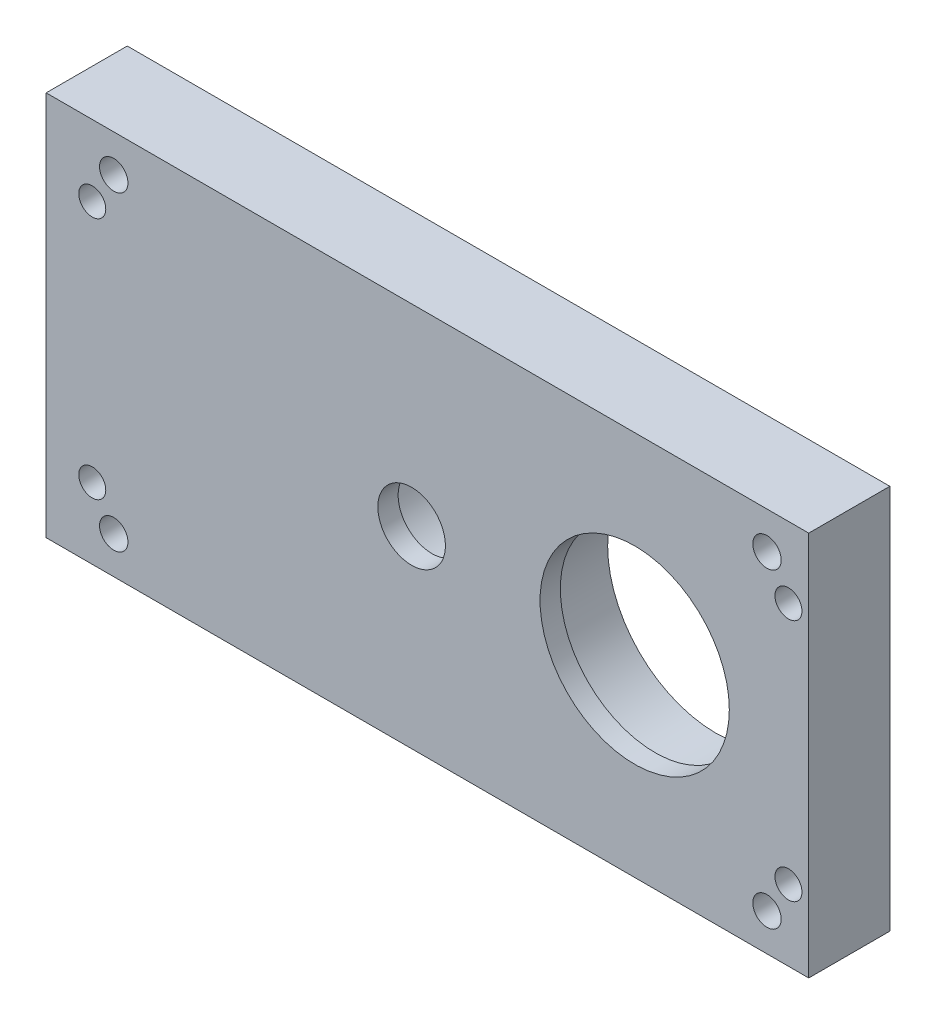
ISO-10303-21;
HEADER;
FILE_DESCRIPTION(('STEP AP214'),'2;1');
FILE_NAME('part.step','',(''),(''),'','','');
FILE_SCHEMA(('AUTOMOTIVE_DESIGN { 1 0 10303 214 1 1 1 1 }'));
ENDSEC;
DATA;
#1=APPLICATION_CONTEXT('core data for automotive mechanical design processes');
#2=APPLICATION_PROTOCOL_DEFINITION('international standard','automotive_design',2000,#1);
#3=PRODUCT_CONTEXT('',#1,'mechanical');
#4=PRODUCT('Part','Part','',(#3));
#5=PRODUCT_RELATED_PRODUCT_CATEGORY('part','',(#4));
#6=PRODUCT_DEFINITION_FORMATION('','',#4);
#7=PRODUCT_DEFINITION_CONTEXT('part definition',#1,'design');
#8=PRODUCT_DEFINITION('design','',#6,#7);
#9=PRODUCT_DEFINITION_SHAPE('','',#8);
#10=(LENGTH_UNIT() NAMED_UNIT(*) SI_UNIT(.MILLI.,.METRE.));
#11=(NAMED_UNIT(*) PLANE_ANGLE_UNIT() SI_UNIT($,.RADIAN.));
#12=(NAMED_UNIT(*) SI_UNIT($,.STERADIAN.) SOLID_ANGLE_UNIT());
#13=UNCERTAINTY_MEASURE_WITH_UNIT(LENGTH_MEASURE(1.E-05),#10,'distance_accuracy_value','');
#14=(GEOMETRIC_REPRESENTATION_CONTEXT(3) GLOBAL_UNCERTAINTY_ASSIGNED_CONTEXT((#13)) GLOBAL_UNIT_ASSIGNED_CONTEXT((#10,
#11,#12)) REPRESENTATION_CONTEXT('',''));
#15=CARTESIAN_POINT('',(0.,0.,0.));
#16=DIRECTION('',(0.,0.,1.));
#17=DIRECTION('',(1.,0.,0.));
#18=AXIS2_PLACEMENT_3D('',#15,#16,#17);
#19=CARTESIAN_POINT('',(28.75,0.,12.));
#20=DIRECTION('',(0.,0.,-1.));
#21=DIRECTION('',(-1.,0.,0.));
#22=AXIS2_PLACEMENT_3D('',#19,#20,#21);
#23=CYLINDRICAL_SURFACE('',#22,16.);
#24=CARTESIAN_POINT('',(28.75,0.,0.));
#25=DIRECTION('',(0.,0.,1.));
#26=DIRECTION('',(1.,0.,0.));
#27=AXIS2_PLACEMENT_3D('',#24,#25,#26);
#28=CIRCLE('',#27,16.);
#29=CARTESIAN_POINT('',(44.75,0.,0.));
#30=VERTEX_POINT('',#29);
#31=EDGE_CURVE('E49',#30,#30,#28,.T.);
#32=ORIENTED_EDGE('',*,*,#31,.F.);
#33=EDGE_LOOP('',(#32));
#34=FACE_BOUND('',#33,.T.);
#35=CARTESIAN_POINT('',(28.75,0.,9.));
#36=DIRECTION('',(0.,0.,1.));
#37=DIRECTION('',(1.,0.,0.));
#38=AXIS2_PLACEMENT_3D('',#35,#36,#37);
#39=CIRCLE('',#38,16.);
#40=CARTESIAN_POINT('',(44.75,0.,9.));
#41=VERTEX_POINT('',#40);
#42=EDGE_CURVE('E114',#41,#41,#39,.T.);
#43=ORIENTED_EDGE('',*,*,#42,.T.);
#44=EDGE_LOOP('',(#43));
#45=FACE_BOUND('',#44,.T.);
#46=ADVANCED_FACE('F39',(#34,#45),#23,.F.);
#47=CARTESIAN_POINT('',(0.,0.,12.));
#48=DIRECTION('',(0.,0.,1.));
#49=DIRECTION('',(1.,0.,0.));
#50=AXIS2_PLACEMENT_3D('',#47,#48,#49);
#51=PLANE('',#50);
#52=CARTESIAN_POINT('',(-4.25,0.,12.));
#53=DIRECTION('',(0.,0.,1.));
#54=DIRECTION('',(1.,0.,0.));
#55=AXIS2_PLACEMENT_3D('',#52,#53,#54);
#56=CIRCLE('',#55,5.);
#57=CARTESIAN_POINT('',(0.75,0.,12.));
#58=VERTEX_POINT('',#57);
#59=EDGE_CURVE('E43',#58,#58,#56,.T.);
#60=ORIENTED_EDGE('',*,*,#59,.F.);
#61=EDGE_LOOP('',(#60));
#62=FACE_BOUND('',#61,.T.);
#63=CARTESIAN_POINT('',(-51.5,18.,12.));
#64=DIRECTION('',(0.,0.,1.));
#65=DIRECTION('',(1.,0.,0.));
#66=AXIS2_PLACEMENT_3D('',#63,#64,#65);
#67=CIRCLE('',#66,2.);
#68=CARTESIAN_POINT('',(-49.5,18.,12.));
#69=VERTEX_POINT('',#68);
#70=EDGE_CURVE('E163',#69,#69,#67,.T.);
#71=ORIENTED_EDGE('',*,*,#70,.F.);
#72=EDGE_LOOP('',(#71));
#73=FACE_BOUND('',#72,.T.);
#74=CARTESIAN_POINT('',(51.5,18.,12.));
#75=DIRECTION('',(0.,0.,1.));
#76=DIRECTION('',(1.,0.,0.));
#77=AXIS2_PLACEMENT_3D('',#74,#75,#76);
#78=CIRCLE('',#77,2.);
#79=CARTESIAN_POINT('',(53.5,18.,12.));
#80=VERTEX_POINT('',#79);
#81=EDGE_CURVE('E179',#80,#80,#78,.T.);
#82=ORIENTED_EDGE('',*,*,#81,.F.);
#83=EDGE_LOOP('',(#82));
#84=FACE_BOUND('',#83,.T.);
#85=CARTESIAN_POINT('',(51.5,-18.,12.));
#86=DIRECTION('',(0.,0.,1.));
#87=DIRECTION('',(1.,0.,0.));
#88=AXIS2_PLACEMENT_3D('',#85,#86,#87);
#89=CIRCLE('',#88,2.);
#90=CARTESIAN_POINT('',(53.5,-18.,12.));
#91=VERTEX_POINT('',#90);
#92=EDGE_CURVE('E187',#91,#91,#89,.T.);
#93=ORIENTED_EDGE('',*,*,#92,.F.);
#94=EDGE_LOOP('',(#93));
#95=FACE_BOUND('',#94,.T.);
#96=CARTESIAN_POINT('',(-51.5,-18.,12.));
#97=DIRECTION('',(0.,0.,1.));
#98=DIRECTION('',(1.,0.,0.));
#99=AXIS2_PLACEMENT_3D('',#96,#97,#98);
#100=CIRCLE('',#99,2.);
#101=CARTESIAN_POINT('',(-49.5,-18.,12.));
#102=VERTEX_POINT('',#101);
#103=EDGE_CURVE('E171',#102,#102,#100,.T.);
#104=ORIENTED_EDGE('',*,*,#103,.F.);
#105=EDGE_LOOP('',(#104));
#106=FACE_BOUND('',#105,.T.);
#107=CARTESIAN_POINT('',(48.32,23.,12.));
#108=DIRECTION('',(0.,0.,1.));
#109=DIRECTION('',(1.,0.,0.));
#110=AXIS2_PLACEMENT_3D('',#107,#108,#109);
#111=CIRCLE('',#110,2.09999999999999);
#112=CARTESIAN_POINT('',(50.42,23.,12.));
#113=VERTEX_POINT('',#112);
#114=EDGE_CURVE('E154',#113,#113,#111,.T.);
#115=ORIENTED_EDGE('',*,*,#114,.F.);
#116=EDGE_LOOP('',(#115));
#117=FACE_BOUND('',#116,.T.);
#118=CARTESIAN_POINT('',(48.32,-23.,12.));
#119=DIRECTION('',(0.,0.,1.));
#120=DIRECTION('',(1.,0.,0.));
#121=AXIS2_PLACEMENT_3D('',#118,#119,#120);
#122=CIRCLE('',#121,2.09999999999998);
#123=CARTESIAN_POINT('',(50.42,-23.,12.));
#124=VERTEX_POINT('',#123);
#125=EDGE_CURVE('E146',#124,#124,#122,.T.);
#126=ORIENTED_EDGE('',*,*,#125,.F.);
#127=EDGE_LOOP('',(#126));
#128=FACE_BOUND('',#127,.T.);
#129=CARTESIAN_POINT('',(-48.32,-23.,12.));
#130=DIRECTION('',(0.,0.,1.));
#131=DIRECTION('',(1.,0.,0.));
#132=AXIS2_PLACEMENT_3D('',#129,#130,#131);
#133=CIRCLE('',#132,2.09999999999998);
#134=CARTESIAN_POINT('',(-46.22,-23.,12.));
#135=VERTEX_POINT('',#134);
#136=EDGE_CURVE('E138',#135,#135,#133,.T.);
#137=ORIENTED_EDGE('',*,*,#136,.F.);
#138=EDGE_LOOP('',(#137));
#139=FACE_BOUND('',#138,.T.);
#140=CARTESIAN_POINT('',(-48.32,23.,12.));
#141=DIRECTION('',(0.,0.,1.));
#142=DIRECTION('',(1.,0.,0.));
#143=AXIS2_PLACEMENT_3D('',#140,#141,#142);
#144=CIRCLE('',#143,2.09999999999999);
#145=CARTESIAN_POINT('',(-46.22,23.,12.));
#146=VERTEX_POINT('',#145);
#147=EDGE_CURVE('E130',#146,#146,#144,.T.);
#148=ORIENTED_EDGE('',*,*,#147,.F.);
#149=EDGE_LOOP('',(#148));
#150=FACE_BOUND('',#149,.T.);
#151=DIRECTION('',(0.,1.,0.));
#152=VECTOR('',#151,1.);
#153=CARTESIAN_POINT('',(54.5,-28.5,12.));
#154=LINE('',#153,#152);
#155=CARTESIAN_POINT('',(54.5,-28.5,12.));
#156=VERTEX_POINT('',#155);
#157=CARTESIAN_POINT('',(54.5,28.5,12.));
#158=VERTEX_POINT('',#157);
#159=EDGE_CURVE('E88',#156,#158,#154,.T.);
#160=ORIENTED_EDGE('',*,*,#159,.T.);
#161=DIRECTION('',(-1.,0.,0.));
#162=VECTOR('',#161,1.);
#163=CARTESIAN_POINT('',(-58.32,28.5,12.));
#164=LINE('',#163,#162);
#165=CARTESIAN_POINT('',(-58.32,28.5,12.));
#166=VERTEX_POINT('',#165);
#167=EDGE_CURVE('E109',#158,#166,#164,.T.);
#168=ORIENTED_EDGE('',*,*,#167,.T.);
#169=DIRECTION('',(0.,-1.,0.));
#170=VECTOR('',#169,1.);
#171=CARTESIAN_POINT('',(-58.32,28.5,12.));
#172=LINE('',#171,#170);
#173=CARTESIAN_POINT('',(-58.32,-28.5,12.));
#174=VERTEX_POINT('',#173);
#175=EDGE_CURVE('E113',#166,#174,#172,.T.);
#176=ORIENTED_EDGE('',*,*,#175,.T.);
#177=DIRECTION('',(1.,0.,0.));
#178=VECTOR('',#177,1.);
#179=CARTESIAN_POINT('',(-58.32,-28.5,12.));
#180=LINE('',#179,#178);
#181=EDGE_CURVE('E56',#174,#156,#180,.T.);
#182=ORIENTED_EDGE('',*,*,#181,.T.);
#183=EDGE_LOOP('',(#160,#168,#176,#182));
#184=FACE_BOUND('',#183,.T.);
#185=CARTESIAN_POINT('',(28.75,0.,12.));
#186=DIRECTION('',(0.,0.,1.));
#187=DIRECTION('',(1.,0.,0.));
#188=AXIS2_PLACEMENT_3D('',#185,#186,#187);
#189=CIRCLE('',#188,14.);
#190=CARTESIAN_POINT('',(42.75,0.,12.));
#191=VERTEX_POINT('',#190);
#192=EDGE_CURVE('E212',#191,#191,#189,.T.);
#193=ORIENTED_EDGE('',*,*,#192,.F.);
#194=EDGE_LOOP('',(#193));
#195=FACE_BOUND('',#194,.T.);
#196=ADVANCED_FACE('F202',(#62,#73,#84,#95,#106,#117,#128,#139,#150,#184,#195),#51,.T.);
#197=CARTESIAN_POINT('',(0.,0.,0.));
#198=DIRECTION('',(0.,0.,1.));
#199=DIRECTION('',(1.,0.,0.));
#200=AXIS2_PLACEMENT_3D('',#197,#198,#199);
#201=PLANE('',#200);
#202=CARTESIAN_POINT('',(-51.5,18.,0.));
#203=DIRECTION('',(0.,0.,1.));
#204=DIRECTION('',(1.,0.,0.));
#205=AXIS2_PLACEMENT_3D('',#202,#203,#204);
#206=CIRCLE('',#205,2.);
#207=CARTESIAN_POINT('',(-49.5,18.,0.));
#208=VERTEX_POINT('',#207);
#209=EDGE_CURVE('E162',#208,#208,#206,.T.);
#210=ORIENTED_EDGE('',*,*,#209,.T.);
#211=EDGE_LOOP('',(#210));
#212=FACE_BOUND('',#211,.T.);
#213=CARTESIAN_POINT('',(-51.5,-18.,0.));
#214=DIRECTION('',(0.,0.,1.));
#215=DIRECTION('',(1.,0.,0.));
#216=AXIS2_PLACEMENT_3D('',#213,#214,#215);
#217=CIRCLE('',#216,2.);
#218=CARTESIAN_POINT('',(-49.5,-18.,0.));
#219=VERTEX_POINT('',#218);
#220=EDGE_CURVE('E167',#219,#219,#217,.T.);
#221=ORIENTED_EDGE('',*,*,#220,.T.);
#222=EDGE_LOOP('',(#221));
#223=FACE_BOUND('',#222,.T.);
#224=CARTESIAN_POINT('',(51.5,18.,0.));
#225=DIRECTION('',(0.,0.,1.));
#226=DIRECTION('',(1.,0.,0.));
#227=AXIS2_PLACEMENT_3D('',#224,#225,#226);
#228=CIRCLE('',#227,2.);
#229=CARTESIAN_POINT('',(53.5,18.,0.));
#230=VERTEX_POINT('',#229);
#231=EDGE_CURVE('E175',#230,#230,#228,.T.);
#232=ORIENTED_EDGE('',*,*,#231,.T.);
#233=EDGE_LOOP('',(#232));
#234=FACE_BOUND('',#233,.T.);
#235=CARTESIAN_POINT('',(51.5,-18.,0.));
#236=DIRECTION('',(0.,0.,1.));
#237=DIRECTION('',(1.,0.,0.));
#238=AXIS2_PLACEMENT_3D('',#235,#236,#237);
#239=CIRCLE('',#238,2.);
#240=CARTESIAN_POINT('',(53.5,-18.,0.));
#241=VERTEX_POINT('',#240);
#242=EDGE_CURVE('E183',#241,#241,#239,.T.);
#243=ORIENTED_EDGE('',*,*,#242,.T.);
#244=EDGE_LOOP('',(#243));
#245=FACE_BOUND('',#244,.T.);
#246=ORIENTED_EDGE('',*,*,#31,.T.);
#247=EDGE_LOOP('',(#246));
#248=FACE_BOUND('',#247,.T.);
#249=CARTESIAN_POINT('',(-4.25,0.,0.));
#250=DIRECTION('',(0.,0.,1.));
#251=DIRECTION('',(1.,0.,0.));
#252=AXIS2_PLACEMENT_3D('',#249,#250,#251);
#253=CIRCLE('',#252,9.5);
#254=CARTESIAN_POINT('',(5.25,0.,0.));
#255=VERTEX_POINT('',#254);
#256=EDGE_CURVE('E11',#255,#255,#253,.T.);
#257=ORIENTED_EDGE('',*,*,#256,.T.);
#258=EDGE_LOOP('',(#257));
#259=FACE_BOUND('',#258,.T.);
#260=CARTESIAN_POINT('',(48.32,23.,0.));
#261=DIRECTION('',(0.,0.,1.));
#262=DIRECTION('',(1.,0.,0.));
#263=AXIS2_PLACEMENT_3D('',#260,#261,#262);
#264=CIRCLE('',#263,2.1);
#265=CARTESIAN_POINT('',(50.42,23.,0.));
#266=VERTEX_POINT('',#265);
#267=EDGE_CURVE('E158',#266,#266,#264,.T.);
#268=ORIENTED_EDGE('',*,*,#267,.T.);
#269=EDGE_LOOP('',(#268));
#270=FACE_BOUND('',#269,.T.);
#271=CARTESIAN_POINT('',(48.32,-23.,0.));
#272=DIRECTION('',(0.,0.,1.));
#273=DIRECTION('',(1.,0.,0.));
#274=AXIS2_PLACEMENT_3D('',#271,#272,#273);
#275=CIRCLE('',#274,2.1);
#276=CARTESIAN_POINT('',(50.42,-23.,0.));
#277=VERTEX_POINT('',#276);
#278=EDGE_CURVE('E150',#277,#277,#275,.T.);
#279=ORIENTED_EDGE('',*,*,#278,.T.);
#280=EDGE_LOOP('',(#279));
#281=FACE_BOUND('',#280,.T.);
#282=CARTESIAN_POINT('',(-48.32,-23.,0.));
#283=DIRECTION('',(0.,0.,1.));
#284=DIRECTION('',(1.,0.,0.));
#285=AXIS2_PLACEMENT_3D('',#282,#283,#284);
#286=CIRCLE('',#285,2.1);
#287=CARTESIAN_POINT('',(-46.22,-23.,0.));
#288=VERTEX_POINT('',#287);
#289=EDGE_CURVE('E142',#288,#288,#286,.T.);
#290=ORIENTED_EDGE('',*,*,#289,.T.);
#291=EDGE_LOOP('',(#290));
#292=FACE_BOUND('',#291,.T.);
#293=CARTESIAN_POINT('',(-48.32,23.,0.));
#294=DIRECTION('',(0.,0.,1.));
#295=DIRECTION('',(1.,0.,0.));
#296=AXIS2_PLACEMENT_3D('',#293,#294,#295);
#297=CIRCLE('',#296,2.1);
#298=CARTESIAN_POINT('',(-46.22,23.,0.));
#299=VERTEX_POINT('',#298);
#300=EDGE_CURVE('E134',#299,#299,#297,.T.);
#301=ORIENTED_EDGE('',*,*,#300,.T.);
#302=EDGE_LOOP('',(#301));
#303=FACE_BOUND('',#302,.T.);
#304=DIRECTION('',(-1.,0.,0.));
#305=VECTOR('',#304,1.);
#306=CARTESIAN_POINT('',(-58.32,28.5,0.));
#307=LINE('',#306,#305);
#308=CARTESIAN_POINT('',(54.5,28.5,0.));
#309=VERTEX_POINT('',#308);
#310=CARTESIAN_POINT('',(-58.32,28.5,0.));
#311=VERTEX_POINT('',#310);
#312=EDGE_CURVE('E64',#309,#311,#307,.T.);
#313=ORIENTED_EDGE('',*,*,#312,.F.);
#314=DIRECTION('',(0.,1.,0.));
#315=VECTOR('',#314,1.);
#316=CARTESIAN_POINT('',(54.5,-28.5,0.));
#317=LINE('',#316,#315);
#318=CARTESIAN_POINT('',(54.5,-28.5,0.));
#319=VERTEX_POINT('',#318);
#320=EDGE_CURVE('E86',#319,#309,#317,.T.);
#321=ORIENTED_EDGE('',*,*,#320,.F.);
#322=DIRECTION('',(1.,0.,0.));
#323=VECTOR('',#322,1.);
#324=CARTESIAN_POINT('',(-58.32,-28.5,0.));
#325=LINE('',#324,#323);
#326=CARTESIAN_POINT('',(-58.32,-28.5,0.));
#327=VERTEX_POINT('',#326);
#328=EDGE_CURVE('E94',#327,#319,#325,.T.);
#329=ORIENTED_EDGE('',*,*,#328,.F.);
#330=DIRECTION('',(0.,-1.,0.));
#331=VECTOR('',#330,1.);
#332=CARTESIAN_POINT('',(-58.32,28.5,0.));
#333=LINE('',#332,#331);
#334=EDGE_CURVE('E100',#311,#327,#333,.T.);
#335=ORIENTED_EDGE('',*,*,#334,.F.);
#336=EDGE_LOOP('',(#313,#321,#329,#335));
#337=FACE_BOUND('',#336,.T.);
#338=ADVANCED_FACE('F41',(#212,#223,#234,#245,#248,#259,#270,#281,#292,#303,#337),#201,.F.);
#339=CARTESIAN_POINT('',(-4.25,0.,12.));
#340=DIRECTION('',(0.,0.,-1.));
#341=DIRECTION('',(-1.,0.,0.));
#342=AXIS2_PLACEMENT_3D('',#339,#340,#341);
#343=CYLINDRICAL_SURFACE('',#342,9.5);
#344=ORIENTED_EDGE('',*,*,#256,.F.);
#345=EDGE_LOOP('',(#344));
#346=FACE_BOUND('',#345,.T.);
#347=CARTESIAN_POINT('',(-4.25,0.,9.));
#348=DIRECTION('',(0.,0.,1.));
#349=DIRECTION('',(1.,0.,0.));
#350=AXIS2_PLACEMENT_3D('',#347,#348,#349);
#351=CIRCLE('',#350,9.5);
#352=CARTESIAN_POINT('',(5.25,0.,9.));
#353=VERTEX_POINT('',#352);
#354=EDGE_CURVE('E123',#353,#353,#351,.T.);
#355=ORIENTED_EDGE('',*,*,#354,.T.);
#356=EDGE_LOOP('',(#355));
#357=FACE_BOUND('',#356,.T.);
#358=ADVANCED_FACE('F250',(#346,#357),#343,.F.);
#359=CARTESIAN_POINT('',(51.5,-18.,12.));
#360=DIRECTION('',(0.,0.,-1.));
#361=DIRECTION('',(-1.,0.,0.));
#362=AXIS2_PLACEMENT_3D('',#359,#360,#361);
#363=CYLINDRICAL_SURFACE('',#362,2.);
#364=ORIENTED_EDGE('',*,*,#92,.T.);
#365=EDGE_LOOP('',(#364));
#366=FACE_BOUND('',#365,.T.);
#367=ORIENTED_EDGE('',*,*,#242,.F.);
#368=EDGE_LOOP('',(#367));
#369=FACE_BOUND('',#368,.T.);
#370=ADVANCED_FACE('F252',(#366,#369),#363,.F.);
#371=CARTESIAN_POINT('',(51.5,18.,12.));
#372=DIRECTION('',(0.,0.,-1.));
#373=DIRECTION('',(-1.,0.,0.));
#374=AXIS2_PLACEMENT_3D('',#371,#372,#373);
#375=CYLINDRICAL_SURFACE('',#374,2.);
#376=ORIENTED_EDGE('',*,*,#81,.T.);
#377=EDGE_LOOP('',(#376));
#378=FACE_BOUND('',#377,.T.);
#379=ORIENTED_EDGE('',*,*,#231,.F.);
#380=EDGE_LOOP('',(#379));
#381=FACE_BOUND('',#380,.T.);
#382=ADVANCED_FACE('F259',(#378,#381),#375,.F.);
#383=CARTESIAN_POINT('',(-51.5,-18.,12.));
#384=DIRECTION('',(0.,0.,-1.));
#385=DIRECTION('',(-1.,0.,0.));
#386=AXIS2_PLACEMENT_3D('',#383,#384,#385);
#387=CYLINDRICAL_SURFACE('',#386,2.);
#388=ORIENTED_EDGE('',*,*,#103,.T.);
#389=EDGE_LOOP('',(#388));
#390=FACE_BOUND('',#389,.T.);
#391=ORIENTED_EDGE('',*,*,#220,.F.);
#392=EDGE_LOOP('',(#391));
#393=FACE_BOUND('',#392,.T.);
#394=ADVANCED_FACE('F267',(#390,#393),#387,.F.);
#395=CARTESIAN_POINT('',(-51.5,18.,12.));
#396=DIRECTION('',(0.,0.,-1.));
#397=DIRECTION('',(-1.,0.,0.));
#398=AXIS2_PLACEMENT_3D('',#395,#396,#397);
#399=CYLINDRICAL_SURFACE('',#398,2.);
#400=ORIENTED_EDGE('',*,*,#70,.T.);
#401=EDGE_LOOP('',(#400));
#402=FACE_BOUND('',#401,.T.);
#403=ORIENTED_EDGE('',*,*,#209,.F.);
#404=EDGE_LOOP('',(#403));
#405=FACE_BOUND('',#404,.T.);
#406=ADVANCED_FACE('F271',(#402,#405),#399,.F.);
#407=CARTESIAN_POINT('',(48.32,23.,12.));
#408=DIRECTION('',(0.,0.,1.));
#409=DIRECTION('',(1.,0.,0.));
#410=AXIS2_PLACEMENT_3D('',#407,#408,#409);
#411=CYLINDRICAL_SURFACE('',#410,2.09999999999999);
#412=ORIENTED_EDGE('',*,*,#267,.F.);
#413=EDGE_LOOP('',(#412));
#414=FACE_BOUND('',#413,.T.);
#415=ORIENTED_EDGE('',*,*,#114,.T.);
#416=EDGE_LOOP('',(#415));
#417=FACE_BOUND('',#416,.T.);
#418=ADVANCED_FACE('F275',(#414,#417),#411,.F.);
#419=CARTESIAN_POINT('',(48.32,-23.,12.));
#420=DIRECTION('',(0.,0.,1.));
#421=DIRECTION('',(1.,0.,0.));
#422=AXIS2_PLACEMENT_3D('',#419,#420,#421);
#423=CYLINDRICAL_SURFACE('',#422,2.09999999999999);
#424=ORIENTED_EDGE('',*,*,#278,.F.);
#425=EDGE_LOOP('',(#424));
#426=FACE_BOUND('',#425,.T.);
#427=ORIENTED_EDGE('',*,*,#125,.T.);
#428=EDGE_LOOP('',(#427));
#429=FACE_BOUND('',#428,.T.);
#430=ADVANCED_FACE('F279',(#426,#429),#423,.F.);
#431=CARTESIAN_POINT('',(-48.32,-23.,12.));
#432=DIRECTION('',(0.,0.,1.));
#433=DIRECTION('',(1.,0.,0.));
#434=AXIS2_PLACEMENT_3D('',#431,#432,#433);
#435=CYLINDRICAL_SURFACE('',#434,2.09999999999999);
#436=ORIENTED_EDGE('',*,*,#289,.F.);
#437=EDGE_LOOP('',(#436));
#438=FACE_BOUND('',#437,.T.);
#439=ORIENTED_EDGE('',*,*,#136,.T.);
#440=EDGE_LOOP('',(#439));
#441=FACE_BOUND('',#440,.T.);
#442=ADVANCED_FACE('F283',(#438,#441),#435,.F.);
#443=CARTESIAN_POINT('',(-48.32,23.,12.));
#444=DIRECTION('',(0.,0.,1.));
#445=DIRECTION('',(1.,0.,0.));
#446=AXIS2_PLACEMENT_3D('',#443,#444,#445);
#447=CYLINDRICAL_SURFACE('',#446,2.09999999999999);
#448=ORIENTED_EDGE('',*,*,#300,.F.);
#449=EDGE_LOOP('',(#448));
#450=FACE_BOUND('',#449,.T.);
#451=ORIENTED_EDGE('',*,*,#147,.T.);
#452=EDGE_LOOP('',(#451));
#453=FACE_BOUND('',#452,.T.);
#454=ADVANCED_FACE('F246',(#450,#453),#447,.F.);
#455=CARTESIAN_POINT('',(-4.25,0.,9.));
#456=DIRECTION('',(0.,0.,1.));
#457=DIRECTION('',(1.,0.,0.));
#458=AXIS2_PLACEMENT_3D('',#455,#456,#457);
#459=PLANE('',#458);
#460=CARTESIAN_POINT('',(-4.25,0.,9.));
#461=DIRECTION('',(0.,0.,-1.));
#462=DIRECTION('',(-1.,0.,0.));
#463=AXIS2_PLACEMENT_3D('',#460,#461,#462);
#464=CIRCLE('',#463,5.);
#465=CARTESIAN_POINT('',(-9.25,0.,9.));
#466=VERTEX_POINT('',#465);
#467=EDGE_CURVE('E233',#466,#466,#464,.T.);
#468=ORIENTED_EDGE('',*,*,#467,.F.);
#469=EDGE_LOOP('',(#468));
#470=FACE_BOUND('',#469,.T.);
#471=ORIENTED_EDGE('',*,*,#354,.F.);
#472=EDGE_LOOP('',(#471));
#473=FACE_BOUND('',#472,.T.);
#474=ADVANCED_FACE('F243',(#470,#473),#459,.F.);
#475=CARTESIAN_POINT('',(-58.32,28.5,0.));
#476=DIRECTION('',(0.,1.,0.));
#477=DIRECTION('',(0.,0.,1.));
#478=AXIS2_PLACEMENT_3D('',#475,#476,#477);
#479=PLANE('',#478);
#480=ORIENTED_EDGE('',*,*,#167,.F.);
#481=DIRECTION('',(0.,0.,1.));
#482=VECTOR('',#481,1.);
#483=CARTESIAN_POINT('',(54.5,28.5,0.));
#484=LINE('',#483,#482);
#485=EDGE_CURVE('E90',#309,#158,#484,.T.);
#486=ORIENTED_EDGE('',*,*,#485,.F.);
#487=ORIENTED_EDGE('',*,*,#312,.T.);
#488=DIRECTION('',(0.,0.,1.));
#489=VECTOR('',#488,1.);
#490=CARTESIAN_POINT('',(-58.32,28.5,0.));
#491=LINE('',#490,#489);
#492=EDGE_CURVE('E103',#311,#166,#491,.T.);
#493=ORIENTED_EDGE('',*,*,#492,.T.);
#494=EDGE_LOOP('',(#480,#486,#487,#493));
#495=FACE_BOUND('',#494,.T.);
#496=ADVANCED_FACE('F222',(#495),#479,.T.);
#497=CARTESIAN_POINT('',(54.5,-28.5,0.));
#498=DIRECTION('',(1.,0.,0.));
#499=DIRECTION('',(0.,1.,0.));
#500=AXIS2_PLACEMENT_3D('',#497,#498,#499);
#501=PLANE('',#500);
#502=ORIENTED_EDGE('',*,*,#159,.F.);
#503=DIRECTION('',(0.,0.,1.));
#504=VECTOR('',#503,1.);
#505=CARTESIAN_POINT('',(54.5,-28.5,0.));
#506=LINE('',#505,#504);
#507=EDGE_CURVE('E82',#319,#156,#506,.T.);
#508=ORIENTED_EDGE('',*,*,#507,.F.);
#509=ORIENTED_EDGE('',*,*,#320,.T.);
#510=ORIENTED_EDGE('',*,*,#485,.T.);
#511=EDGE_LOOP('',(#502,#508,#509,#510));
#512=FACE_BOUND('',#511,.T.);
#513=ADVANCED_FACE('F84',(#512),#501,.T.);
#514=CARTESIAN_POINT('',(-58.32,-28.5,0.));
#515=DIRECTION('',(0.,-1.,0.));
#516=DIRECTION('',(0.,0.,-1.));
#517=AXIS2_PLACEMENT_3D('',#514,#515,#516);
#518=PLANE('',#517);
#519=ORIENTED_EDGE('',*,*,#181,.F.);
#520=DIRECTION('',(0.,0.,1.));
#521=VECTOR('',#520,1.);
#522=CARTESIAN_POINT('',(-58.32,-28.5,0.));
#523=LINE('',#522,#521);
#524=EDGE_CURVE('E91',#327,#174,#523,.T.);
#525=ORIENTED_EDGE('',*,*,#524,.F.);
#526=ORIENTED_EDGE('',*,*,#328,.T.);
#527=ORIENTED_EDGE('',*,*,#507,.T.);
#528=EDGE_LOOP('',(#519,#525,#526,#527));
#529=FACE_BOUND('',#528,.T.);
#530=ADVANCED_FACE('F95',(#529),#518,.T.);
#531=CARTESIAN_POINT('',(-58.32,28.5,0.));
#532=DIRECTION('',(-1.,0.,0.));
#533=DIRECTION('',(0.,-1.,0.));
#534=AXIS2_PLACEMENT_3D('',#531,#532,#533);
#535=PLANE('',#534);
#536=ORIENTED_EDGE('',*,*,#175,.F.);
#537=ORIENTED_EDGE('',*,*,#492,.F.);
#538=ORIENTED_EDGE('',*,*,#334,.T.);
#539=ORIENTED_EDGE('',*,*,#524,.T.);
#540=EDGE_LOOP('',(#536,#537,#538,#539));
#541=FACE_BOUND('',#540,.T.);
#542=ADVANCED_FACE('F220',(#541),#535,.T.);
#543=CARTESIAN_POINT('',(28.75,0.,9.));
#544=DIRECTION('',(0.,0.,1.));
#545=DIRECTION('',(1.,0.,0.));
#546=AXIS2_PLACEMENT_3D('',#543,#544,#545);
#547=PLANE('',#546);
#548=CARTESIAN_POINT('',(28.75,0.,9.));
#549=DIRECTION('',(0.,0.,1.));
#550=DIRECTION('',(1.,0.,0.));
#551=AXIS2_PLACEMENT_3D('',#548,#549,#550);
#552=CIRCLE('',#551,14.);
#553=CARTESIAN_POINT('',(42.75,0.,9.));
#554=VERTEX_POINT('',#553);
#555=EDGE_CURVE('E208',#554,#554,#552,.T.);
#556=ORIENTED_EDGE('',*,*,#555,.T.);
#557=EDGE_LOOP('',(#556));
#558=FACE_BOUND('',#557,.T.);
#559=ORIENTED_EDGE('',*,*,#42,.F.);
#560=EDGE_LOOP('',(#559));
#561=FACE_BOUND('',#560,.T.);
#562=ADVANCED_FACE('F295',(#558,#561),#547,.F.);
#563=CARTESIAN_POINT('',(28.75,0.,9.));
#564=DIRECTION('',(0.,0.,1.));
#565=DIRECTION('',(1.,0.,0.));
#566=AXIS2_PLACEMENT_3D('',#563,#564,#565);
#567=CYLINDRICAL_SURFACE('',#566,14.);
#568=ORIENTED_EDGE('',*,*,#555,.F.);
#569=EDGE_LOOP('',(#568));
#570=FACE_BOUND('',#569,.T.);
#571=ORIENTED_EDGE('',*,*,#192,.T.);
#572=EDGE_LOOP('',(#571));
#573=FACE_BOUND('',#572,.T.);
#574=ADVANCED_FACE('F302',(#570,#573),#567,.F.);
#575=CARTESIAN_POINT('',(-4.25,0.,19.));
#576=DIRECTION('',(0.,0.,-1.));
#577=DIRECTION('',(-1.,0.,0.));
#578=AXIS2_PLACEMENT_3D('',#575,#576,#577);
#579=CYLINDRICAL_SURFACE('',#578,5.);
#580=ORIENTED_EDGE('',*,*,#59,.T.);
#581=EDGE_LOOP('',(#580));
#582=FACE_BOUND('',#581,.T.);
#583=ORIENTED_EDGE('',*,*,#467,.T.);
#584=EDGE_LOOP('',(#583));
#585=FACE_BOUND('',#584,.T.);
#586=ADVANCED_FACE('F241',(#582,#585),#579,.F.);
#587=CLOSED_SHELL('',(#46,#196,#338,#358,#370,#382,#394,#406,#418,#430,#442,#454,#474,#496,#513,
#530,#542,#562,#574,#586));
#588=MANIFOLD_SOLID_BREP('B2',#587);
#589=ADVANCED_BREP_SHAPE_REPRESENTATION('',(#18,#588),#14);
#590=SHAPE_DEFINITION_REPRESENTATION(#9,#589);
ENDSEC;
END-ISO-10303-21;
